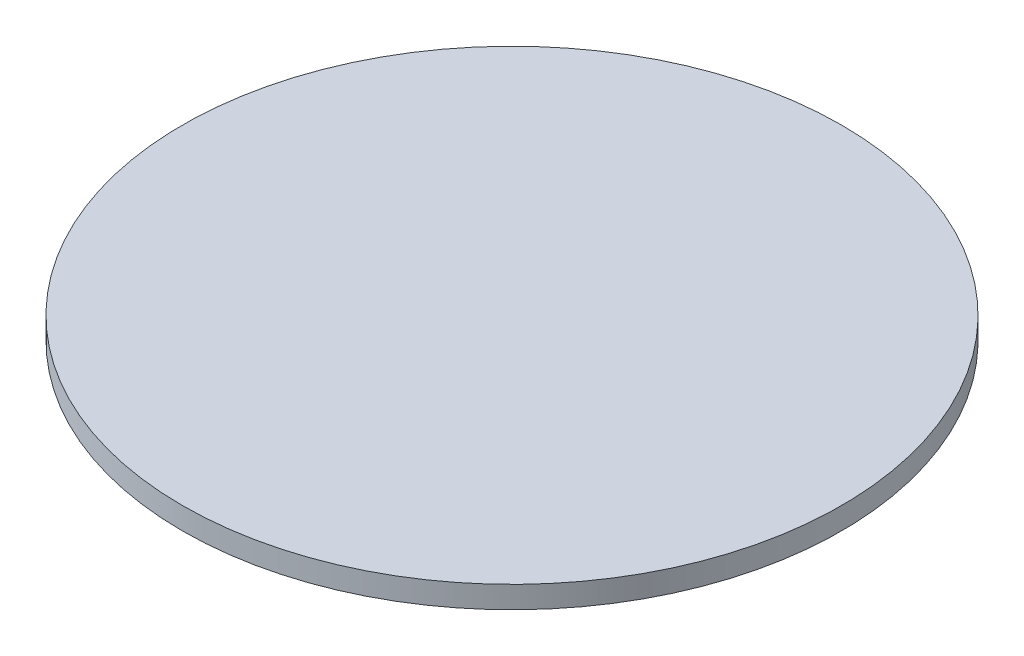
ISO-10303-21;
HEADER;
FILE_DESCRIPTION(('STEP AP214'),'2;1');
FILE_NAME('part.step','',(''),(''),'','','');
FILE_SCHEMA(('AUTOMOTIVE_DESIGN { 1 0 10303 214 1 1 1 1 }'));
ENDSEC;
DATA;
#1=APPLICATION_CONTEXT('core data for automotive mechanical design processes');
#2=APPLICATION_PROTOCOL_DEFINITION('international standard','automotive_design',2000,#1);
#3=PRODUCT_CONTEXT('',#1,'mechanical');
#4=PRODUCT('Part','Part','',(#3));
#5=PRODUCT_RELATED_PRODUCT_CATEGORY('part','',(#4));
#6=PRODUCT_DEFINITION_FORMATION('','',#4);
#7=PRODUCT_DEFINITION_CONTEXT('part definition',#1,'design');
#8=PRODUCT_DEFINITION('design','',#6,#7);
#9=PRODUCT_DEFINITION_SHAPE('','',#8);
#10=(LENGTH_UNIT() NAMED_UNIT(*) SI_UNIT(.MILLI.,.METRE.));
#11=(NAMED_UNIT(*) PLANE_ANGLE_UNIT() SI_UNIT($,.RADIAN.));
#12=(NAMED_UNIT(*) SI_UNIT($,.STERADIAN.) SOLID_ANGLE_UNIT());
#13=UNCERTAINTY_MEASURE_WITH_UNIT(LENGTH_MEASURE(1.E-05),#10,'distance_accuracy_value','');
#14=(GEOMETRIC_REPRESENTATION_CONTEXT(3) GLOBAL_UNCERTAINTY_ASSIGNED_CONTEXT((#13)) GLOBAL_UNIT_ASSIGNED_CONTEXT((#10,
#11,#12)) REPRESENTATION_CONTEXT('',''));
#15=CARTESIAN_POINT('',(0.,0.,0.));
#16=DIRECTION('',(0.,0.,1.));
#17=DIRECTION('',(1.,0.,0.));
#18=AXIS2_PLACEMENT_3D('',#15,#16,#17);
#19=CARTESIAN_POINT('',(0.,6.35,0.));
#20=DIRECTION('',(0.,-1.,0.));
#21=DIRECTION('',(0.,0.,-1.));
#22=AXIS2_PLACEMENT_3D('',#19,#20,#21);
#23=CYLINDRICAL_SURFACE('',#22,95.123);
#24=CARTESIAN_POINT('',(0.,6.35,0.));
#25=DIRECTION('',(0.,1.,0.));
#26=DIRECTION('',(0.,0.,1.));
#27=AXIS2_PLACEMENT_3D('',#24,#25,#26);
#28=CIRCLE('',#27,95.123);
#29=CARTESIAN_POINT('',(0.,6.35,95.123));
#30=VERTEX_POINT('',#29);
#31=EDGE_CURVE('E10',#30,#30,#28,.T.);
#32=ORIENTED_EDGE('',*,*,#31,.F.);
#33=EDGE_LOOP('',(#32));
#34=FACE_BOUND('',#33,.T.);
#35=CARTESIAN_POINT('',(0.,0.,0.));
#36=DIRECTION('',(0.,1.,0.));
#37=DIRECTION('',(0.,0.,1.));
#38=AXIS2_PLACEMENT_3D('',#35,#36,#37);
#39=CIRCLE('',#38,95.123);
#40=CARTESIAN_POINT('',(0.,0.,95.123));
#41=VERTEX_POINT('',#40);
#42=EDGE_CURVE('E34',#41,#41,#39,.T.);
#43=ORIENTED_EDGE('',*,*,#42,.T.);
#44=EDGE_LOOP('',(#43));
#45=FACE_BOUND('',#44,.T.);
#46=ADVANCED_FACE('F31',(#34,#45),#23,.T.);
#47=CARTESIAN_POINT('',(0.,6.35,0.));
#48=DIRECTION('',(0.,1.,0.));
#49=DIRECTION('',(0.,0.,1.));
#50=AXIS2_PLACEMENT_3D('',#47,#48,#49);
#51=PLANE('',#50);
#52=ORIENTED_EDGE('',*,*,#31,.T.);
#53=EDGE_LOOP('',(#52));
#54=FACE_BOUND('',#53,.T.);
#55=ADVANCED_FACE('F46',(#54),#51,.T.);
#56=CARTESIAN_POINT('',(0.,0.,0.));
#57=DIRECTION('',(0.,1.,0.));
#58=DIRECTION('',(0.,0.,1.));
#59=AXIS2_PLACEMENT_3D('',#56,#57,#58);
#60=PLANE('',#59);
#61=ORIENTED_EDGE('',*,*,#42,.F.);
#62=EDGE_LOOP('',(#61));
#63=FACE_BOUND('',#62,.T.);
#64=ADVANCED_FACE('F44',(#63),#60,.F.);
#65=CLOSED_SHELL('',(#46,#55,#64));
#66=MANIFOLD_SOLID_BREP('B2',#65);
#67=ADVANCED_BREP_SHAPE_REPRESENTATION('',(#18,#66),#14);
#68=SHAPE_DEFINITION_REPRESENTATION(#9,#67);
ENDSEC;
END-ISO-10303-21;
